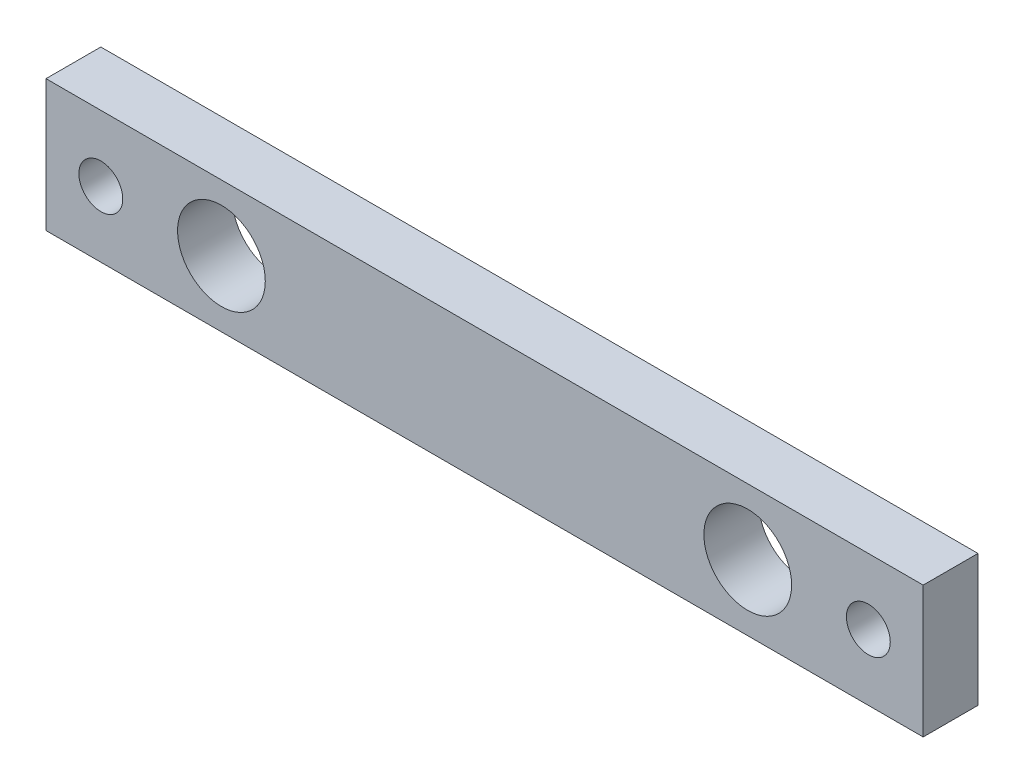
ISO-10303-21;
HEADER;
FILE_DESCRIPTION(('STEP AP214'),'2;1');
FILE_NAME('part.step','',(''),(''),'','','');
FILE_SCHEMA(('AUTOMOTIVE_DESIGN { 1 0 10303 214 1 1 1 1 }'));
ENDSEC;
DATA;
#1=APPLICATION_CONTEXT('core data for automotive mechanical design processes');
#2=APPLICATION_PROTOCOL_DEFINITION('international standard','automotive_design',2000,#1);
#3=PRODUCT_CONTEXT('',#1,'mechanical');
#4=PRODUCT('Part','Part','',(#3));
#5=PRODUCT_RELATED_PRODUCT_CATEGORY('part','',(#4));
#6=PRODUCT_DEFINITION_FORMATION('','',#4);
#7=PRODUCT_DEFINITION_CONTEXT('part definition',#1,'design');
#8=PRODUCT_DEFINITION('design','',#6,#7);
#9=PRODUCT_DEFINITION_SHAPE('','',#8);
#10=(LENGTH_UNIT() NAMED_UNIT(*) SI_UNIT(.MILLI.,.METRE.));
#11=(NAMED_UNIT(*) PLANE_ANGLE_UNIT() SI_UNIT($,.RADIAN.));
#12=(NAMED_UNIT(*) SI_UNIT($,.STERADIAN.) SOLID_ANGLE_UNIT());
#13=UNCERTAINTY_MEASURE_WITH_UNIT(LENGTH_MEASURE(1.E-05),#10,'distance_accuracy_value','');
#14=(GEOMETRIC_REPRESENTATION_CONTEXT(3) GLOBAL_UNCERTAINTY_ASSIGNED_CONTEXT((#13)) GLOBAL_UNIT_ASSIGNED_CONTEXT((#10,
#11,#12)) REPRESENTATION_CONTEXT('',''));
#15=CARTESIAN_POINT('',(0.,0.,0.));
#16=DIRECTION('',(0.,0.,1.));
#17=DIRECTION('',(1.,0.,0.));
#18=AXIS2_PLACEMENT_3D('',#15,#16,#17);
#19=CARTESIAN_POINT('',(0.,0.,5.));
#20=DIRECTION('',(0.,0.,1.));
#21=DIRECTION('',(1.,0.,0.));
#22=AXIS2_PLACEMENT_3D('',#19,#20,#21);
#23=PLANE('',#22);
#24=CARTESIAN_POINT('',(-34.,0.,5.));
#25=DIRECTION('',(0.,0.,1.));
#26=DIRECTION('',(1.,0.,0.));
#27=AXIS2_PLACEMENT_3D('',#24,#25,#26);
#28=CIRCLE('',#27,3.99999999999999);
#29=CARTESIAN_POINT('',(-30.,0.,5.));
#30=VERTEX_POINT('',#29);
#31=EDGE_CURVE('E120',#30,#30,#28,.T.);
#32=ORIENTED_EDGE('',*,*,#31,.F.);
#33=EDGE_LOOP('',(#32));
#34=FACE_BOUND('',#33,.T.);
#35=CARTESIAN_POINT('',(-45.,0.,5.));
#36=DIRECTION('',(0.,0.,1.));
#37=DIRECTION('',(1.,0.,0.));
#38=AXIS2_PLACEMENT_3D('',#35,#36,#37);
#39=CIRCLE('',#38,2.);
#40=CARTESIAN_POINT('',(-43.,0.,5.));
#41=VERTEX_POINT('',#40);
#42=EDGE_CURVE('E99',#41,#41,#39,.T.);
#43=ORIENTED_EDGE('',*,*,#42,.F.);
#44=EDGE_LOOP('',(#43));
#45=FACE_BOUND('',#44,.T.);
#46=DIRECTION('',(-1.,0.,0.));
#47=VECTOR('',#46,1.);
#48=CARTESIAN_POINT('',(30.,6.,5.));
#49=LINE('',#48,#47);
#50=CARTESIAN_POINT('',(30.,6.,5.));
#51=VERTEX_POINT('',#50);
#52=CARTESIAN_POINT('',(-50.,5.99999999999999,5.));
#53=VERTEX_POINT('',#52);
#54=EDGE_CURVE('E84',#51,#53,#49,.T.);
#55=ORIENTED_EDGE('',*,*,#54,.T.);
#56=DIRECTION('',(0.,-1.,0.));
#57=VECTOR('',#56,1.);
#58=CARTESIAN_POINT('',(-50.,5.99999999999999,5.));
#59=LINE('',#58,#57);
#60=CARTESIAN_POINT('',(-50.,-6.00000000000001,5.));
#61=VERTEX_POINT('',#60);
#62=EDGE_CURVE('E79',#53,#61,#59,.T.);
#63=ORIENTED_EDGE('',*,*,#62,.T.);
#64=DIRECTION('',(1.,0.,0.));
#65=VECTOR('',#64,1.);
#66=CARTESIAN_POINT('',(-50.,-6.00000000000001,5.));
#67=LINE('',#66,#65);
#68=CARTESIAN_POINT('',(30.,-6.,5.));
#69=VERTEX_POINT('',#68);
#70=EDGE_CURVE('E82',#61,#69,#67,.T.);
#71=ORIENTED_EDGE('',*,*,#70,.T.);
#72=DIRECTION('',(0.,1.,0.));
#73=VECTOR('',#72,1.);
#74=CARTESIAN_POINT('',(30.,-6.,5.));
#75=LINE('',#74,#73);
#76=EDGE_CURVE('E49',#69,#51,#75,.T.);
#77=ORIENTED_EDGE('',*,*,#76,.T.);
#78=EDGE_LOOP('',(#55,#63,#71,#77));
#79=FACE_BOUND('',#78,.T.);
#80=CARTESIAN_POINT('',(25.,0.,5.));
#81=DIRECTION('',(0.,0.,1.));
#82=DIRECTION('',(1.,0.,0.));
#83=AXIS2_PLACEMENT_3D('',#80,#81,#82);
#84=CIRCLE('',#83,2.);
#85=CARTESIAN_POINT('',(27.,0.,5.));
#86=VERTEX_POINT('',#85);
#87=EDGE_CURVE('E114',#86,#86,#84,.T.);
#88=ORIENTED_EDGE('',*,*,#87,.F.);
#89=EDGE_LOOP('',(#88));
#90=FACE_BOUND('',#89,.T.);
#91=CARTESIAN_POINT('',(14.,0.,5.));
#92=DIRECTION('',(0.,0.,1.));
#93=DIRECTION('',(1.,0.,0.));
#94=AXIS2_PLACEMENT_3D('',#91,#92,#93);
#95=CIRCLE('',#94,4.);
#96=CARTESIAN_POINT('',(18.,0.,5.));
#97=VERTEX_POINT('',#96);
#98=EDGE_CURVE('E126',#97,#97,#95,.T.);
#99=ORIENTED_EDGE('',*,*,#98,.F.);
#100=EDGE_LOOP('',(#99));
#101=FACE_BOUND('',#100,.T.);
#102=ADVANCED_FACE('F32',(#34,#45,#79,#90,#101),#23,.T.);
#103=CARTESIAN_POINT('',(0.,0.,0.));
#104=DIRECTION('',(0.,0.,1.));
#105=DIRECTION('',(1.,0.,0.));
#106=AXIS2_PLACEMENT_3D('',#103,#104,#105);
#107=PLANE('',#106);
#108=DIRECTION('',(-1.,0.,0.));
#109=VECTOR('',#108,1.);
#110=CARTESIAN_POINT('',(30.,6.,0.));
#111=LINE('',#110,#109);
#112=CARTESIAN_POINT('',(30.,6.,0.));
#113=VERTEX_POINT('',#112);
#114=CARTESIAN_POINT('',(-50.,5.99999999999999,0.));
#115=VERTEX_POINT('',#114);
#116=EDGE_CURVE('E96',#113,#115,#111,.T.);
#117=ORIENTED_EDGE('',*,*,#116,.F.);
#118=DIRECTION('',(0.,1.,0.));
#119=VECTOR('',#118,1.);
#120=CARTESIAN_POINT('',(30.,-6.,0.));
#121=LINE('',#120,#119);
#122=CARTESIAN_POINT('',(30.,-6.,0.));
#123=VERTEX_POINT('',#122);
#124=EDGE_CURVE('E72',#123,#113,#121,.T.);
#125=ORIENTED_EDGE('',*,*,#124,.F.);
#126=DIRECTION('',(1.,0.,0.));
#127=VECTOR('',#126,1.);
#128=CARTESIAN_POINT('',(-50.,-6.00000000000001,0.));
#129=LINE('',#128,#127);
#130=CARTESIAN_POINT('',(-50.,-6.00000000000001,0.));
#131=VERTEX_POINT('',#130);
#132=EDGE_CURVE('E66',#131,#123,#129,.T.);
#133=ORIENTED_EDGE('',*,*,#132,.F.);
#134=DIRECTION('',(0.,-1.,0.));
#135=VECTOR('',#134,1.);
#136=CARTESIAN_POINT('',(-50.,5.99999999999999,0.));
#137=LINE('',#136,#135);
#138=EDGE_CURVE('E88',#115,#131,#137,.T.);
#139=ORIENTED_EDGE('',*,*,#138,.F.);
#140=EDGE_LOOP('',(#117,#125,#133,#139));
#141=FACE_BOUND('',#140,.T.);
#142=CARTESIAN_POINT('',(-45.,0.,0.));
#143=DIRECTION('',(0.,0.,1.));
#144=DIRECTION('',(1.,0.,0.));
#145=AXIS2_PLACEMENT_3D('',#142,#143,#144);
#146=CIRCLE('',#145,2.);
#147=CARTESIAN_POINT('',(-43.,0.,0.));
#148=VERTEX_POINT('',#147);
#149=EDGE_CURVE('E111',#148,#148,#146,.T.);
#150=ORIENTED_EDGE('',*,*,#149,.T.);
#151=EDGE_LOOP('',(#150));
#152=FACE_BOUND('',#151,.T.);
#153=CARTESIAN_POINT('',(25.,0.,0.));
#154=DIRECTION('',(0.,0.,1.));
#155=DIRECTION('',(1.,0.,0.));
#156=AXIS2_PLACEMENT_3D('',#153,#154,#155);
#157=CIRCLE('',#156,2.);
#158=CARTESIAN_POINT('',(27.,0.,0.));
#159=VERTEX_POINT('',#158);
#160=EDGE_CURVE('E117',#159,#159,#157,.T.);
#161=ORIENTED_EDGE('',*,*,#160,.T.);
#162=EDGE_LOOP('',(#161));
#163=FACE_BOUND('',#162,.T.);
#164=CARTESIAN_POINT('',(-34.,0.,0.));
#165=DIRECTION('',(0.,0.,1.));
#166=DIRECTION('',(1.,0.,0.));
#167=AXIS2_PLACEMENT_3D('',#164,#165,#166);
#168=CIRCLE('',#167,3.99999999999999);
#169=CARTESIAN_POINT('',(-30.,0.,0.));
#170=VERTEX_POINT('',#169);
#171=EDGE_CURVE('E123',#170,#170,#168,.T.);
#172=ORIENTED_EDGE('',*,*,#171,.T.);
#173=EDGE_LOOP('',(#172));
#174=FACE_BOUND('',#173,.T.);
#175=CARTESIAN_POINT('',(14.,0.,0.));
#176=DIRECTION('',(0.,0.,1.));
#177=DIRECTION('',(1.,0.,0.));
#178=AXIS2_PLACEMENT_3D('',#175,#176,#177);
#179=CIRCLE('',#178,4.);
#180=CARTESIAN_POINT('',(18.,0.,0.));
#181=VERTEX_POINT('',#180);
#182=EDGE_CURVE('E129',#181,#181,#179,.T.);
#183=ORIENTED_EDGE('',*,*,#182,.T.);
#184=EDGE_LOOP('',(#183));
#185=FACE_BOUND('',#184,.T.);
#186=ADVANCED_FACE('F107',(#141,#152,#163,#174,#185),#107,.F.);
#187=CARTESIAN_POINT('',(30.,6.,5.));
#188=DIRECTION('',(0.,-1.,0.));
#189=DIRECTION('',(1.,0.,0.));
#190=AXIS2_PLACEMENT_3D('',#187,#188,#189);
#191=PLANE('',#190);
#192=ORIENTED_EDGE('',*,*,#116,.T.);
#193=DIRECTION('',(0.,0.,-1.));
#194=VECTOR('',#193,1.);
#195=CARTESIAN_POINT('',(-50.,5.99999999999999,5.));
#196=LINE('',#195,#194);
#197=EDGE_CURVE('E11',#53,#115,#196,.T.);
#198=ORIENTED_EDGE('',*,*,#197,.F.);
#199=ORIENTED_EDGE('',*,*,#54,.F.);
#200=DIRECTION('',(0.,0.,-1.));
#201=VECTOR('',#200,1.);
#202=CARTESIAN_POINT('',(30.,6.,5.));
#203=LINE('',#202,#201);
#204=EDGE_CURVE('E92',#51,#113,#203,.T.);
#205=ORIENTED_EDGE('',*,*,#204,.T.);
#206=EDGE_LOOP('',(#192,#198,#199,#205));
#207=FACE_BOUND('',#206,.T.);
#208=ADVANCED_FACE('F34',(#207),#191,.F.);
#209=CARTESIAN_POINT('',(-50.,5.99999999999999,5.));
#210=DIRECTION('',(1.,0.,0.));
#211=DIRECTION('',(0.,0.,-1.));
#212=AXIS2_PLACEMENT_3D('',#209,#210,#211);
#213=PLANE('',#212);
#214=ORIENTED_EDGE('',*,*,#138,.T.);
#215=DIRECTION('',(0.,0.,-1.));
#216=VECTOR('',#215,1.);
#217=CARTESIAN_POINT('',(-50.,-6.00000000000001,5.));
#218=LINE('',#217,#216);
#219=EDGE_CURVE('E41',#61,#131,#218,.T.);
#220=ORIENTED_EDGE('',*,*,#219,.F.);
#221=ORIENTED_EDGE('',*,*,#62,.F.);
#222=ORIENTED_EDGE('',*,*,#197,.T.);
#223=EDGE_LOOP('',(#214,#220,#221,#222));
#224=FACE_BOUND('',#223,.T.);
#225=ADVANCED_FACE('F87',(#224),#213,.F.);
#226=CARTESIAN_POINT('',(-50.,-6.00000000000001,5.));
#227=DIRECTION('',(0.,1.,0.));
#228=DIRECTION('',(-1.,0.,0.));
#229=AXIS2_PLACEMENT_3D('',#226,#227,#228);
#230=PLANE('',#229);
#231=ORIENTED_EDGE('',*,*,#132,.T.);
#232=DIRECTION('',(0.,0.,-1.));
#233=VECTOR('',#232,1.);
#234=CARTESIAN_POINT('',(30.,-6.,5.));
#235=LINE('',#234,#233);
#236=EDGE_CURVE('E89',#69,#123,#235,.T.);
#237=ORIENTED_EDGE('',*,*,#236,.F.);
#238=ORIENTED_EDGE('',*,*,#70,.F.);
#239=ORIENTED_EDGE('',*,*,#219,.T.);
#240=EDGE_LOOP('',(#231,#237,#238,#239));
#241=FACE_BOUND('',#240,.T.);
#242=ADVANCED_FACE('F90',(#241),#230,.F.);
#243=CARTESIAN_POINT('',(30.,-6.,5.));
#244=DIRECTION('',(-1.,0.,0.));
#245=DIRECTION('',(0.,-1.,0.));
#246=AXIS2_PLACEMENT_3D('',#243,#244,#245);
#247=PLANE('',#246);
#248=ORIENTED_EDGE('',*,*,#124,.T.);
#249=ORIENTED_EDGE('',*,*,#204,.F.);
#250=ORIENTED_EDGE('',*,*,#76,.F.);
#251=ORIENTED_EDGE('',*,*,#236,.T.);
#252=EDGE_LOOP('',(#248,#249,#250,#251));
#253=FACE_BOUND('',#252,.T.);
#254=ADVANCED_FACE('F104',(#253),#247,.F.);
#255=CARTESIAN_POINT('',(-45.,0.,5.));
#256=DIRECTION('',(0.,0.,-1.));
#257=DIRECTION('',(-1.,0.,0.));
#258=AXIS2_PLACEMENT_3D('',#255,#256,#257);
#259=CYLINDRICAL_SURFACE('',#258,2.);
#260=ORIENTED_EDGE('',*,*,#42,.T.);
#261=EDGE_LOOP('',(#260));
#262=FACE_BOUND('',#261,.T.);
#263=ORIENTED_EDGE('',*,*,#149,.F.);
#264=EDGE_LOOP('',(#263));
#265=FACE_BOUND('',#264,.T.);
#266=ADVANCED_FACE('F148',(#262,#265),#259,.F.);
#267=CARTESIAN_POINT('',(25.,0.,5.));
#268=DIRECTION('',(0.,0.,-1.));
#269=DIRECTION('',(-1.,0.,0.));
#270=AXIS2_PLACEMENT_3D('',#267,#268,#269);
#271=CYLINDRICAL_SURFACE('',#270,2.);
#272=ORIENTED_EDGE('',*,*,#87,.T.);
#273=EDGE_LOOP('',(#272));
#274=FACE_BOUND('',#273,.T.);
#275=ORIENTED_EDGE('',*,*,#160,.F.);
#276=EDGE_LOOP('',(#275));
#277=FACE_BOUND('',#276,.T.);
#278=ADVANCED_FACE('F194',(#274,#277),#271,.F.);
#279=CARTESIAN_POINT('',(-34.,0.,5.));
#280=DIRECTION('',(0.,0.,-1.));
#281=DIRECTION('',(-1.,0.,0.));
#282=AXIS2_PLACEMENT_3D('',#279,#280,#281);
#283=CYLINDRICAL_SURFACE('',#282,3.99999999999999);
#284=ORIENTED_EDGE('',*,*,#31,.T.);
#285=EDGE_LOOP('',(#284));
#286=FACE_BOUND('',#285,.T.);
#287=ORIENTED_EDGE('',*,*,#171,.F.);
#288=EDGE_LOOP('',(#287));
#289=FACE_BOUND('',#288,.T.);
#290=ADVANCED_FACE('F202',(#286,#289),#283,.F.);
#291=CARTESIAN_POINT('',(14.,0.,5.));
#292=DIRECTION('',(0.,0.,-1.));
#293=DIRECTION('',(-1.,0.,0.));
#294=AXIS2_PLACEMENT_3D('',#291,#292,#293);
#295=CYLINDRICAL_SURFACE('',#294,4.);
#296=ORIENTED_EDGE('',*,*,#98,.T.);
#297=EDGE_LOOP('',(#296));
#298=FACE_BOUND('',#297,.T.);
#299=ORIENTED_EDGE('',*,*,#182,.F.);
#300=EDGE_LOOP('',(#299));
#301=FACE_BOUND('',#300,.T.);
#302=ADVANCED_FACE('F135',(#298,#301),#295,.F.);
#303=CLOSED_SHELL('',(#102,#186,#208,#225,#242,#254,#266,#278,#290,#302));
#304=MANIFOLD_SOLID_BREP('B2',#303);
#305=ADVANCED_BREP_SHAPE_REPRESENTATION('',(#18,#304),#14);
#306=SHAPE_DEFINITION_REPRESENTATION(#9,#305);
ENDSEC;
END-ISO-10303-21;
